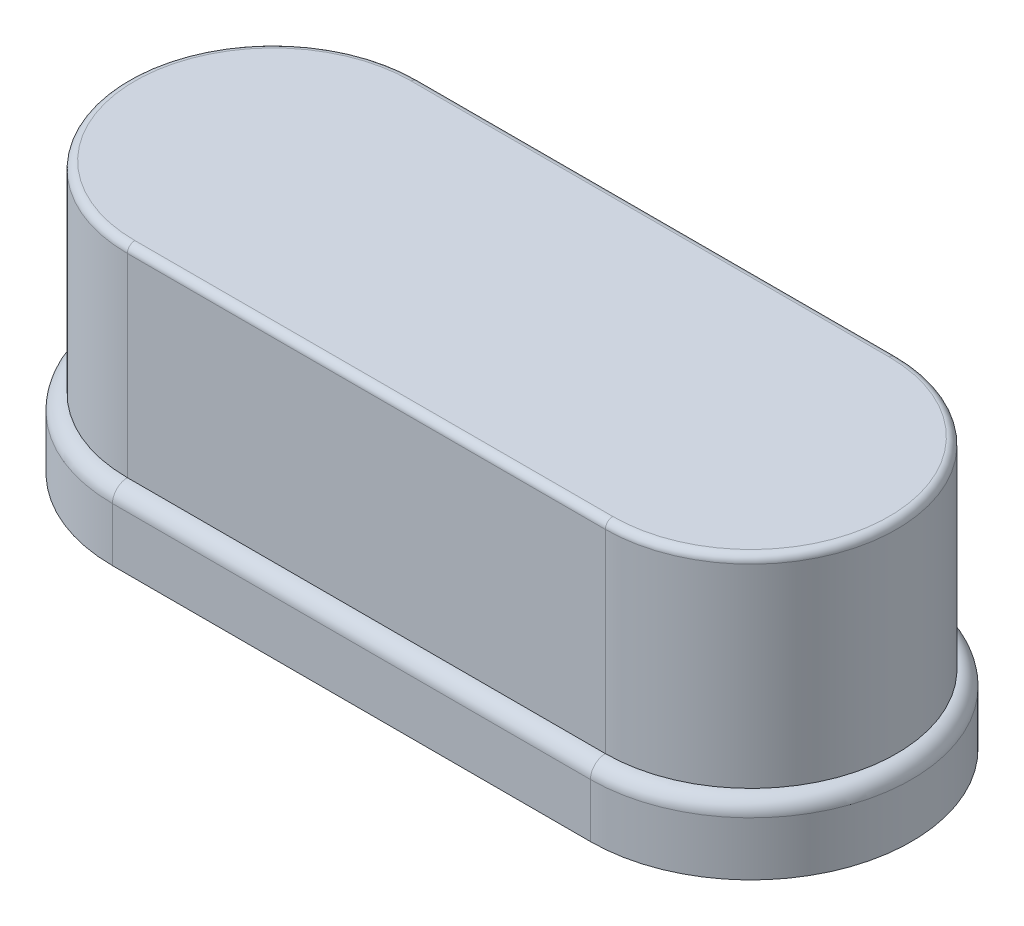
ISO-10303-21;
HEADER;
FILE_DESCRIPTION(('STEP AP214'),'2;1');
FILE_NAME('part.step','',(''),(''),'','','');
FILE_SCHEMA(('AUTOMOTIVE_DESIGN { 1 0 10303 214 1 1 1 1 }'));
ENDSEC;
DATA;
#1=APPLICATION_CONTEXT('core data for automotive mechanical design processes');
#2=APPLICATION_PROTOCOL_DEFINITION('international standard','automotive_design',2000,#1);
#3=PRODUCT_CONTEXT('',#1,'mechanical');
#4=PRODUCT('Part','Part','',(#3));
#5=PRODUCT_RELATED_PRODUCT_CATEGORY('part','',(#4));
#6=PRODUCT_DEFINITION_FORMATION('','',#4);
#7=PRODUCT_DEFINITION_CONTEXT('part definition',#1,'design');
#8=PRODUCT_DEFINITION('design','',#6,#7);
#9=PRODUCT_DEFINITION_SHAPE('','',#8);
#10=(LENGTH_UNIT() NAMED_UNIT(*) SI_UNIT(.MILLI.,.METRE.));
#11=(NAMED_UNIT(*) PLANE_ANGLE_UNIT() SI_UNIT($,.RADIAN.));
#12=(NAMED_UNIT(*) SI_UNIT($,.STERADIAN.) SOLID_ANGLE_UNIT());
#13=UNCERTAINTY_MEASURE_WITH_UNIT(LENGTH_MEASURE(1.E-05),#10,'distance_accuracy_value','');
#14=(GEOMETRIC_REPRESENTATION_CONTEXT(3) GLOBAL_UNCERTAINTY_ASSIGNED_CONTEXT((#13)) GLOBAL_UNIT_ASSIGNED_CONTEXT((#10,
#11,#12)) REPRESENTATION_CONTEXT('',''));
#15=CARTESIAN_POINT('',(0.,0.,0.));
#16=DIRECTION('',(0.,0.,1.));
#17=DIRECTION('',(1.,0.,0.));
#18=AXIS2_PLACEMENT_3D('',#15,#16,#17);
#19=CARTESIAN_POINT('',(8.77463258317007,0.92,-12.7227258149233));
#20=DIRECTION('',(0.,-1.,0.));
#21=DIRECTION('',(0.,0.,-1.));
#22=AXIS2_PLACEMENT_3D('',#19,#20,#21);
#23=CYLINDRICAL_SURFACE('',#22,2.15);
#24=DIRECTION('',(0.,-1.,0.));
#25=VECTOR('',#24,1.);
#26=CARTESIAN_POINT('',(8.77463258317007,0.92,-10.5727258149233));
#27=LINE('',#26,#25);
#28=CARTESIAN_POINT('',(8.77463258317007,0.72,-10.5727258149233));
#29=VERTEX_POINT('',#28);
#30=CARTESIAN_POINT('',(8.77463258317007,0.,-10.5727258149233));
#31=VERTEX_POINT('',#30);
#32=EDGE_CURVE('E132',#29,#31,#27,.T.);
#33=ORIENTED_EDGE('',*,*,#32,.F.);
#34=CARTESIAN_POINT('',(8.77463258317007,0.72,-12.7227258149233));
#35=DIRECTION('',(0.,1.,0.));
#36=DIRECTION('',(0.,0.,1.));
#37=AXIS2_PLACEMENT_3D('',#34,#35,#36);
#38=CIRCLE('',#37,2.15);
#39=CARTESIAN_POINT('',(8.77463258317007,0.72,-14.8727258149233));
#40=VERTEX_POINT('',#39);
#41=EDGE_CURVE('E157',#29,#40,#38,.F.);
#42=ORIENTED_EDGE('',*,*,#41,.T.);
#43=DIRECTION('',(0.,-1.,0.));
#44=VECTOR('',#43,1.);
#45=CARTESIAN_POINT('',(8.77463258317007,0.92,-14.8727258149233));
#46=LINE('',#45,#44);
#47=CARTESIAN_POINT('',(8.77463258317007,0.,-14.8727258149233));
#48=VERTEX_POINT('',#47);
#49=EDGE_CURVE('E217',#40,#48,#46,.T.);
#50=ORIENTED_EDGE('',*,*,#49,.T.);
#51=CARTESIAN_POINT('',(8.77463258317007,0.,-12.7227258149233));
#52=DIRECTION('',(0.,1.,0.));
#53=DIRECTION('',(0.,0.,1.));
#54=AXIS2_PLACEMENT_3D('',#51,#52,#53);
#55=CIRCLE('',#54,2.15);
#56=EDGE_CURVE('E165',#48,#31,#55,.T.);
#57=ORIENTED_EDGE('',*,*,#56,.T.);
#58=EDGE_LOOP('',(#33,#42,#50,#57));
#59=FACE_BOUND('',#58,.T.);
#60=ADVANCED_FACE('F33',(#59),#23,.T.);
#61=CARTESIAN_POINT('',(8.77463258317007,0.92,-10.5727258149233));
#62=DIRECTION('',(0.,0.,-1.));
#63=DIRECTION('',(-1.,0.,0.));
#64=AXIS2_PLACEMENT_3D('',#61,#62,#63);
#65=PLANE('',#64);
#66=DIRECTION('',(0.,-1.,0.));
#67=VECTOR('',#66,1.);
#68=CARTESIAN_POINT('',(15.1746325831701,0.92,-10.5727258149233));
#69=LINE('',#68,#67);
#70=CARTESIAN_POINT('',(15.1746325831701,0.72,-10.5727258149233));
#71=VERTEX_POINT('',#70);
#72=CARTESIAN_POINT('',(15.1746325831701,0.,-10.5727258149233));
#73=VERTEX_POINT('',#72);
#74=EDGE_CURVE('E221',#71,#73,#69,.T.);
#75=ORIENTED_EDGE('',*,*,#74,.F.);
#76=DIRECTION('',(1.,0.,0.));
#77=VECTOR('',#76,1.);
#78=CARTESIAN_POINT('',(8.77463258317007,0.72,-10.5727258149233));
#79=LINE('',#78,#77);
#80=EDGE_CURVE('E155',#71,#29,#79,.F.);
#81=ORIENTED_EDGE('',*,*,#80,.T.);
#82=ORIENTED_EDGE('',*,*,#32,.T.);
#83=DIRECTION('',(1.,0.,0.));
#84=VECTOR('',#83,1.);
#85=CARTESIAN_POINT('',(8.77463258317007,0.,-10.5727258149233));
#86=LINE('',#85,#84);
#87=EDGE_CURVE('E208',#31,#73,#86,.T.);
#88=ORIENTED_EDGE('',*,*,#87,.T.);
#89=EDGE_LOOP('',(#75,#81,#82,#88));
#90=FACE_BOUND('',#89,.T.);
#91=ADVANCED_FACE('F249',(#90),#65,.F.);
#92=CARTESIAN_POINT('',(15.1746325831701,0.92,-12.7227258149233));
#93=DIRECTION('',(0.,-1.,0.));
#94=DIRECTION('',(0.,0.,-1.));
#95=AXIS2_PLACEMENT_3D('',#92,#93,#94);
#96=CYLINDRICAL_SURFACE('',#95,2.15);
#97=DIRECTION('',(0.,-1.,0.));
#98=VECTOR('',#97,1.);
#99=CARTESIAN_POINT('',(15.1746325831701,0.92,-14.8727258149233));
#100=LINE('',#99,#98);
#101=CARTESIAN_POINT('',(15.1746325831701,0.72,-14.8727258149233));
#102=VERTEX_POINT('',#101);
#103=CARTESIAN_POINT('',(15.1746325831701,0.,-14.8727258149233));
#104=VERTEX_POINT('',#103);
#105=EDGE_CURVE('E219',#102,#104,#100,.T.);
#106=ORIENTED_EDGE('',*,*,#105,.F.);
#107=CARTESIAN_POINT('',(15.1746325831701,0.72,-12.7227258149233));
#108=DIRECTION('',(0.,1.,0.));
#109=DIRECTION('',(0.,0.,1.));
#110=AXIS2_PLACEMENT_3D('',#107,#108,#109);
#111=CIRCLE('',#110,2.15);
#112=EDGE_CURVE('E149',#102,#71,#111,.F.);
#113=ORIENTED_EDGE('',*,*,#112,.T.);
#114=ORIENTED_EDGE('',*,*,#74,.T.);
#115=CARTESIAN_POINT('',(15.1746325831701,0.,-12.7227258149233));
#116=DIRECTION('',(0.,1.,0.));
#117=DIRECTION('',(0.,0.,-1.));
#118=AXIS2_PLACEMENT_3D('',#115,#116,#117);
#119=CIRCLE('',#118,2.15);
#120=EDGE_CURVE('E211',#73,#104,#119,.T.);
#121=ORIENTED_EDGE('',*,*,#120,.T.);
#122=EDGE_LOOP('',(#106,#113,#114,#121));
#123=FACE_BOUND('',#122,.T.);
#124=ADVANCED_FACE('F239',(#123),#96,.T.);
#125=CARTESIAN_POINT('',(8.77463258317007,0.92,-14.8727258149233));
#126=DIRECTION('',(0.,0.,1.));
#127=DIRECTION('',(1.,0.,0.));
#128=AXIS2_PLACEMENT_3D('',#125,#126,#127);
#129=PLANE('',#128);
#130=ORIENTED_EDGE('',*,*,#49,.F.);
#131=DIRECTION('',(-1.,0.,0.));
#132=VECTOR('',#131,1.);
#133=CARTESIAN_POINT('',(15.1746325831701,0.72,-14.8727258149233));
#134=LINE('',#133,#132);
#135=EDGE_CURVE('E141',#40,#102,#134,.F.);
#136=ORIENTED_EDGE('',*,*,#135,.T.);
#137=ORIENTED_EDGE('',*,*,#105,.T.);
#138=DIRECTION('',(-1.,0.,0.));
#139=VECTOR('',#138,1.);
#140=CARTESIAN_POINT('',(8.77463258317007,0.,-14.8727258149233));
#141=LINE('',#140,#139);
#142=EDGE_CURVE('E214',#104,#48,#141,.T.);
#143=ORIENTED_EDGE('',*,*,#142,.T.);
#144=EDGE_LOOP('',(#130,#136,#137,#143));
#145=FACE_BOUND('',#144,.T.);
#146=ADVANCED_FACE('F238',(#145),#129,.F.);
#147=CARTESIAN_POINT('',(8.77463258317007,0.,-12.7227258149233));
#148=DIRECTION('',(0.,1.,0.));
#149=DIRECTION('',(0.,0.,1.));
#150=AXIS2_PLACEMENT_3D('',#147,#148,#149);
#151=PLANE('',#150);
#152=ORIENTED_EDGE('',*,*,#56,.F.);
#153=ORIENTED_EDGE('',*,*,#142,.F.);
#154=ORIENTED_EDGE('',*,*,#120,.F.);
#155=ORIENTED_EDGE('',*,*,#87,.F.);
#156=EDGE_LOOP('',(#152,#153,#154,#155));
#157=FACE_BOUND('',#156,.T.);
#158=ADVANCED_FACE('F245',(#157),#151,.F.);
#159=CARTESIAN_POINT('',(8.77463258317007,0.72,-10.7727258149233));
#160=DIRECTION('',(-1.,0.,0.));
#161=DIRECTION('',(0.,0.,1.));
#162=AXIS2_PLACEMENT_3D('',#159,#160,#161);
#163=CYLINDRICAL_SURFACE('',#162,0.2);
#164=CARTESIAN_POINT('',(8.77463258317007,0.72,-10.7727258149233));
#165=DIRECTION('',(-1.,0.,0.));
#166=DIRECTION('',(0.,0.,1.));
#167=AXIS2_PLACEMENT_3D('',#164,#165,#166);
#168=CIRCLE('',#167,0.2);
#169=CARTESIAN_POINT('',(8.77463258317007,0.92,-10.7727258149233));
#170=VERTEX_POINT('',#169);
#171=EDGE_CURVE('E130',#29,#170,#168,.T.);
#172=ORIENTED_EDGE('',*,*,#171,.F.);
#173=ORIENTED_EDGE('',*,*,#80,.F.);
#174=CARTESIAN_POINT('',(15.1746325831701,0.72,-10.7727258149233));
#175=DIRECTION('',(1.,0.,0.));
#176=DIRECTION('',(0.,0.,-1.));
#177=AXIS2_PLACEMENT_3D('',#174,#175,#176);
#178=CIRCLE('',#177,0.2);
#179=CARTESIAN_POINT('',(15.1746325831701,0.92,-10.7727258149233));
#180=VERTEX_POINT('',#179);
#181=EDGE_CURVE('E162',#180,#71,#178,.T.);
#182=ORIENTED_EDGE('',*,*,#181,.F.);
#183=DIRECTION('',(1.,0.,0.));
#184=VECTOR('',#183,1.);
#185=CARTESIAN_POINT('',(15.1746325831701,0.92,-10.7727258149233));
#186=LINE('',#185,#184);
#187=EDGE_CURVE('E131',#170,#180,#186,.T.);
#188=ORIENTED_EDGE('',*,*,#187,.F.);
#189=EDGE_LOOP('',(#172,#173,#182,#188));
#190=FACE_BOUND('',#189,.T.);
#191=ADVANCED_FACE('F228',(#190),#163,.T.);
#192=CARTESIAN_POINT('',(15.1746325831701,0.72,-12.7227258149233));
#193=DIRECTION('',(0.,1.,0.));
#194=DIRECTION('',(0.,0.,1.));
#195=AXIS2_PLACEMENT_3D('',#192,#193,#194);
#196=TOROIDAL_SURFACE('',#195,1.95,0.2);
#197=ORIENTED_EDGE('',*,*,#181,.T.);
#198=ORIENTED_EDGE('',*,*,#112,.F.);
#199=CARTESIAN_POINT('',(15.1746325831701,0.72,-14.6727258149233));
#200=DIRECTION('',(-1.,0.,0.));
#201=DIRECTION('',(0.,0.,1.));
#202=AXIS2_PLACEMENT_3D('',#199,#200,#201);
#203=CIRCLE('',#202,0.2);
#204=CARTESIAN_POINT('',(15.1746325831701,0.92,-14.6727258149233));
#205=VERTEX_POINT('',#204);
#206=EDGE_CURVE('E142',#205,#102,#203,.T.);
#207=ORIENTED_EDGE('',*,*,#206,.F.);
#208=CARTESIAN_POINT('',(15.1746325831701,0.92,-12.7227258149233));
#209=DIRECTION('',(0.,1.,0.));
#210=DIRECTION('',(0.,0.,1.));
#211=AXIS2_PLACEMENT_3D('',#208,#209,#210);
#212=CIRCLE('',#211,1.95);
#213=EDGE_CURVE('E147',#180,#205,#212,.T.);
#214=ORIENTED_EDGE('',*,*,#213,.F.);
#215=EDGE_LOOP('',(#197,#198,#207,#214));
#216=FACE_BOUND('',#215,.T.);
#217=ADVANCED_FACE('F232',(#216),#196,.T.);
#218=CARTESIAN_POINT('',(8.77463258317007,0.72,-12.7227258149233));
#219=DIRECTION('',(0.,1.,0.));
#220=DIRECTION('',(0.,0.,1.));
#221=AXIS2_PLACEMENT_3D('',#218,#219,#220);
#222=TOROIDAL_SURFACE('',#221,1.95,0.2);
#223=ORIENTED_EDGE('',*,*,#171,.T.);
#224=CARTESIAN_POINT('',(8.77463258317007,0.92,-12.7227258149233));
#225=DIRECTION('',(0.,1.,0.));
#226=DIRECTION('',(0.,0.,1.));
#227=AXIS2_PLACEMENT_3D('',#224,#225,#226);
#228=CIRCLE('',#227,1.95);
#229=CARTESIAN_POINT('',(8.77463258317007,0.92,-14.6727258149233));
#230=VERTEX_POINT('',#229);
#231=EDGE_CURVE('E114',#230,#170,#228,.T.);
#232=ORIENTED_EDGE('',*,*,#231,.F.);
#233=CARTESIAN_POINT('',(8.77463258317007,0.72,-14.6727258149233));
#234=DIRECTION('',(1.,0.,0.));
#235=DIRECTION('',(0.,0.,-1.));
#236=AXIS2_PLACEMENT_3D('',#233,#234,#235);
#237=CIRCLE('',#236,0.2);
#238=EDGE_CURVE('E128',#40,#230,#237,.T.);
#239=ORIENTED_EDGE('',*,*,#238,.F.);
#240=ORIENTED_EDGE('',*,*,#41,.F.);
#241=EDGE_LOOP('',(#223,#232,#239,#240));
#242=FACE_BOUND('',#241,.T.);
#243=ADVANCED_FACE('F126',(#242),#222,.T.);
#244=CARTESIAN_POINT('',(8.77463258317007,0.72,-14.6727258149233));
#245=DIRECTION('',(1.,0.,0.));
#246=DIRECTION('',(0.,0.,-1.));
#247=AXIS2_PLACEMENT_3D('',#244,#245,#246);
#248=CYLINDRICAL_SURFACE('',#247,0.2);
#249=ORIENTED_EDGE('',*,*,#206,.T.);
#250=ORIENTED_EDGE('',*,*,#135,.F.);
#251=ORIENTED_EDGE('',*,*,#238,.T.);
#252=DIRECTION('',(-1.,0.,0.));
#253=VECTOR('',#252,1.);
#254=CARTESIAN_POINT('',(8.77463258317007,0.92,-14.6727258149233));
#255=LINE('',#254,#253);
#256=EDGE_CURVE('E138',#205,#230,#255,.T.);
#257=ORIENTED_EDGE('',*,*,#256,.F.);
#258=EDGE_LOOP('',(#249,#250,#251,#257));
#259=FACE_BOUND('',#258,.T.);
#260=ADVANCED_FACE('F137',(#259),#248,.T.);
#261=CARTESIAN_POINT('',(8.77463258317007,3.62,-12.7227258149233));
#262=DIRECTION('',(0.,-1.,0.));
#263=DIRECTION('',(0.,0.,-1.));
#264=AXIS2_PLACEMENT_3D('',#261,#262,#263);
#265=CYLINDRICAL_SURFACE('',#264,1.95);
#266=DIRECTION('',(0.,-1.,0.));
#267=VECTOR('',#266,1.);
#268=CARTESIAN_POINT('',(8.77463258317007,3.62,-10.7727258149233));
#269=LINE('',#268,#267);
#270=CARTESIAN_POINT('',(8.77463258317007,3.52,-10.7727258149233));
#271=VERTEX_POINT('',#270);
#272=EDGE_CURVE('E143',#271,#170,#269,.T.);
#273=ORIENTED_EDGE('',*,*,#272,.F.);
#274=CARTESIAN_POINT('',(8.77463258317007,3.52,-12.7227258149233));
#275=DIRECTION('',(0.,-1.,0.));
#276=DIRECTION('',(0.,0.,-1.));
#277=AXIS2_PLACEMENT_3D('',#274,#275,#276);
#278=CIRCLE('',#277,1.95);
#279=CARTESIAN_POINT('',(8.77463258317007,3.52,-14.6727258149233));
#280=VERTEX_POINT('',#279);
#281=EDGE_CURVE('E11',#271,#280,#278,.T.);
#282=ORIENTED_EDGE('',*,*,#281,.T.);
#283=DIRECTION('',(0.,-1.,0.));
#284=VECTOR('',#283,1.);
#285=CARTESIAN_POINT('',(8.77463258317007,3.62,-14.6727258149233));
#286=LINE('',#285,#284);
#287=EDGE_CURVE('E111',#280,#230,#286,.T.);
#288=ORIENTED_EDGE('',*,*,#287,.T.);
#289=ORIENTED_EDGE('',*,*,#231,.T.);
#290=EDGE_LOOP('',(#273,#282,#288,#289));
#291=FACE_BOUND('',#290,.T.);
#292=ADVANCED_FACE('F113',(#291),#265,.T.);
#293=CARTESIAN_POINT('',(8.77463258317007,3.62,-10.7727258149233));
#294=DIRECTION('',(0.,0.,-1.));
#295=DIRECTION('',(-1.,0.,0.));
#296=AXIS2_PLACEMENT_3D('',#293,#294,#295);
#297=PLANE('',#296);
#298=DIRECTION('',(0.,-1.,0.));
#299=VECTOR('',#298,1.);
#300=CARTESIAN_POINT('',(15.1746325831701,3.62,-10.7727258149233));
#301=LINE('',#300,#299);
#302=CARTESIAN_POINT('',(15.1746325831701,3.52,-10.7727258149233));
#303=VERTEX_POINT('',#302);
#304=EDGE_CURVE('E201',#303,#180,#301,.T.);
#305=ORIENTED_EDGE('',*,*,#304,.F.);
#306=DIRECTION('',(1.,0.,0.));
#307=VECTOR('',#306,1.);
#308=CARTESIAN_POINT('',(8.77463258317007,3.52,-10.7727258149233));
#309=LINE('',#308,#307);
#310=EDGE_CURVE('E42',#303,#271,#309,.F.);
#311=ORIENTED_EDGE('',*,*,#310,.T.);
#312=ORIENTED_EDGE('',*,*,#272,.T.);
#313=ORIENTED_EDGE('',*,*,#187,.T.);
#314=EDGE_LOOP('',(#305,#311,#312,#313));
#315=FACE_BOUND('',#314,.T.);
#316=ADVANCED_FACE('F225',(#315),#297,.F.);
#317=CARTESIAN_POINT('',(15.1746325831701,3.62,-12.7227258149233));
#318=DIRECTION('',(0.,-1.,0.));
#319=DIRECTION('',(0.,0.,-1.));
#320=AXIS2_PLACEMENT_3D('',#317,#318,#319);
#321=CYLINDRICAL_SURFACE('',#320,1.95);
#322=DIRECTION('',(0.,-1.,0.));
#323=VECTOR('',#322,1.);
#324=CARTESIAN_POINT('',(15.1746325831701,3.62,-14.6727258149233));
#325=LINE('',#324,#323);
#326=CARTESIAN_POINT('',(15.1746325831701,3.52,-14.6727258149233));
#327=VERTEX_POINT('',#326);
#328=EDGE_CURVE('E120',#327,#205,#325,.T.);
#329=ORIENTED_EDGE('',*,*,#328,.F.);
#330=CARTESIAN_POINT('',(15.1746325831701,3.52,-12.7227258149233));
#331=DIRECTION('',(0.,-1.,0.));
#332=DIRECTION('',(0.,0.,-1.));
#333=AXIS2_PLACEMENT_3D('',#330,#331,#332);
#334=CIRCLE('',#333,1.95);
#335=EDGE_CURVE('E57',#327,#303,#334,.T.);
#336=ORIENTED_EDGE('',*,*,#335,.T.);
#337=ORIENTED_EDGE('',*,*,#304,.T.);
#338=ORIENTED_EDGE('',*,*,#213,.T.);
#339=EDGE_LOOP('',(#329,#336,#337,#338));
#340=FACE_BOUND('',#339,.T.);
#341=ADVANCED_FACE('F199',(#340),#321,.T.);
#342=CARTESIAN_POINT('',(8.77463258317007,3.62,-14.6727258149233));
#343=DIRECTION('',(0.,0.,1.));
#344=DIRECTION('',(1.,0.,0.));
#345=AXIS2_PLACEMENT_3D('',#342,#343,#344);
#346=PLANE('',#345);
#347=ORIENTED_EDGE('',*,*,#287,.F.);
#348=DIRECTION('',(-1.,0.,0.));
#349=VECTOR('',#348,1.);
#350=CARTESIAN_POINT('',(8.77463258317007,3.52,-14.6727258149233));
#351=LINE('',#350,#349);
#352=EDGE_CURVE('E174',#280,#327,#351,.F.);
#353=ORIENTED_EDGE('',*,*,#352,.T.);
#354=ORIENTED_EDGE('',*,*,#328,.T.);
#355=ORIENTED_EDGE('',*,*,#256,.T.);
#356=EDGE_LOOP('',(#347,#353,#354,#355));
#357=FACE_BOUND('',#356,.T.);
#358=ADVANCED_FACE('F145',(#357),#346,.F.);
#359=CARTESIAN_POINT('',(8.77463258317007,3.62,-12.7227258149233));
#360=DIRECTION('',(0.,-1.,0.));
#361=DIRECTION('',(0.,0.,-1.));
#362=AXIS2_PLACEMENT_3D('',#359,#360,#361);
#363=PLANE('',#362);
#364=CARTESIAN_POINT('',(15.1746325831701,3.62,-12.7227258149233));
#365=DIRECTION('',(0.,-1.,0.));
#366=DIRECTION('',(0.,0.,-1.));
#367=AXIS2_PLACEMENT_3D('',#364,#365,#366);
#368=CIRCLE('',#367,1.85);
#369=CARTESIAN_POINT('',(15.1746325831701,3.62,-10.8727258149233));
#370=VERTEX_POINT('',#369);
#371=CARTESIAN_POINT('',(15.1746325831701,3.62,-14.5727258149233));
#372=VERTEX_POINT('',#371);
#373=EDGE_CURVE('E169',#370,#372,#368,.F.);
#374=ORIENTED_EDGE('',*,*,#373,.T.);
#375=DIRECTION('',(-1.,0.,0.));
#376=VECTOR('',#375,1.);
#377=CARTESIAN_POINT('',(8.77463258317007,3.62,-14.5727258149233));
#378=LINE('',#377,#376);
#379=CARTESIAN_POINT('',(8.77463258317007,3.62,-14.5727258149233));
#380=VERTEX_POINT('',#379);
#381=EDGE_CURVE('E171',#372,#380,#378,.T.);
#382=ORIENTED_EDGE('',*,*,#381,.T.);
#383=CARTESIAN_POINT('',(8.77463258317007,3.62,-12.7227258149233));
#384=DIRECTION('',(0.,-1.,0.));
#385=DIRECTION('',(0.,0.,-1.));
#386=AXIS2_PLACEMENT_3D('',#383,#384,#385);
#387=CIRCLE('',#386,1.85);
#388=CARTESIAN_POINT('',(8.77463258317007,3.62,-10.8727258149233));
#389=VERTEX_POINT('',#388);
#390=EDGE_CURVE('E158',#380,#389,#387,.F.);
#391=ORIENTED_EDGE('',*,*,#390,.T.);
#392=DIRECTION('',(1.,0.,0.));
#393=VECTOR('',#392,1.);
#394=CARTESIAN_POINT('',(8.77463258317007,3.62,-10.8727258149233));
#395=LINE('',#394,#393);
#396=EDGE_CURVE('E167',#389,#370,#395,.T.);
#397=ORIENTED_EDGE('',*,*,#396,.T.);
#398=EDGE_LOOP('',(#374,#382,#391,#397));
#399=FACE_BOUND('',#398,.T.);
#400=ADVANCED_FACE('F275',(#399),#363,.F.);
#401=CARTESIAN_POINT('',(8.77463258317007,3.52,-10.8727258149233));
#402=DIRECTION('',(1.,0.,0.));
#403=DIRECTION('',(0.,0.,-1.));
#404=AXIS2_PLACEMENT_3D('',#401,#402,#403);
#405=CYLINDRICAL_SURFACE('',#404,0.1);
#406=CARTESIAN_POINT('',(8.77463258317007,3.52,-10.8727258149233));
#407=DIRECTION('',(-1.,0.,0.));
#408=DIRECTION('',(0.,0.,1.));
#409=AXIS2_PLACEMENT_3D('',#406,#407,#408);
#410=CIRCLE('',#409,0.1);
#411=EDGE_CURVE('E181',#271,#389,#410,.T.);
#412=ORIENTED_EDGE('',*,*,#411,.F.);
#413=ORIENTED_EDGE('',*,*,#310,.F.);
#414=CARTESIAN_POINT('',(15.1746325831701,3.52,-10.8727258149233));
#415=DIRECTION('',(1.,0.,0.));
#416=DIRECTION('',(0.,0.,-1.));
#417=AXIS2_PLACEMENT_3D('',#414,#415,#416);
#418=CIRCLE('',#417,0.1);
#419=EDGE_CURVE('E37',#370,#303,#418,.T.);
#420=ORIENTED_EDGE('',*,*,#419,.F.);
#421=ORIENTED_EDGE('',*,*,#396,.F.);
#422=EDGE_LOOP('',(#412,#413,#420,#421));
#423=FACE_BOUND('',#422,.T.);
#424=ADVANCED_FACE('F35',(#423),#405,.T.);
#425=CARTESIAN_POINT('',(15.1746325831701,3.52,-12.7227258149233));
#426=DIRECTION('',(0.,-1.,0.));
#427=DIRECTION('',(0.,0.,-1.));
#428=AXIS2_PLACEMENT_3D('',#425,#426,#427);
#429=TOROIDAL_SURFACE('',#428,1.85,0.1);
#430=ORIENTED_EDGE('',*,*,#419,.T.);
#431=ORIENTED_EDGE('',*,*,#335,.F.);
#432=CARTESIAN_POINT('',(15.1746325831701,3.52,-14.5727258149233));
#433=DIRECTION('',(-1.,0.,0.));
#434=DIRECTION('',(0.,0.,1.));
#435=AXIS2_PLACEMENT_3D('',#432,#433,#434);
#436=CIRCLE('',#435,0.1);
#437=EDGE_CURVE('E180',#372,#327,#436,.T.);
#438=ORIENTED_EDGE('',*,*,#437,.F.);
#439=ORIENTED_EDGE('',*,*,#373,.F.);
#440=EDGE_LOOP('',(#430,#431,#438,#439));
#441=FACE_BOUND('',#440,.T.);
#442=ADVANCED_FACE('F190',(#441),#429,.T.);
#443=CARTESIAN_POINT('',(8.77463258317007,3.52,-12.7227258149233));
#444=DIRECTION('',(0.,-1.,0.));
#445=DIRECTION('',(0.,0.,-1.));
#446=AXIS2_PLACEMENT_3D('',#443,#444,#445);
#447=TOROIDAL_SURFACE('',#446,1.85,0.1);
#448=ORIENTED_EDGE('',*,*,#411,.T.);
#449=ORIENTED_EDGE('',*,*,#390,.F.);
#450=CARTESIAN_POINT('',(8.77463258317007,3.52,-14.5727258149233));
#451=DIRECTION('',(1.,0.,0.));
#452=DIRECTION('',(0.,0.,-1.));
#453=AXIS2_PLACEMENT_3D('',#450,#451,#452);
#454=CIRCLE('',#453,0.1);
#455=EDGE_CURVE('E178',#280,#380,#454,.T.);
#456=ORIENTED_EDGE('',*,*,#455,.F.);
#457=ORIENTED_EDGE('',*,*,#281,.F.);
#458=EDGE_LOOP('',(#448,#449,#456,#457));
#459=FACE_BOUND('',#458,.T.);
#460=ADVANCED_FACE('F195',(#459),#447,.T.);
#461=CARTESIAN_POINT('',(8.77463258317007,3.52,-14.5727258149233));
#462=DIRECTION('',(-1.,0.,0.));
#463=DIRECTION('',(0.,0.,1.));
#464=AXIS2_PLACEMENT_3D('',#461,#462,#463);
#465=CYLINDRICAL_SURFACE('',#464,0.1);
#466=ORIENTED_EDGE('',*,*,#437,.T.);
#467=ORIENTED_EDGE('',*,*,#352,.F.);
#468=ORIENTED_EDGE('',*,*,#455,.T.);
#469=ORIENTED_EDGE('',*,*,#381,.F.);
#470=EDGE_LOOP('',(#466,#467,#468,#469));
#471=FACE_BOUND('',#470,.T.);
#472=ADVANCED_FACE('F198',(#471),#465,.T.);
#473=CLOSED_SHELL('',(#60,#91,#124,#146,#158,#191,#217,#243,#260,#292,#316,#341,#358,#400,#424,
#442,#460,#472));
#474=MANIFOLD_SOLID_BREP('B2',#473);
#475=ADVANCED_BREP_SHAPE_REPRESENTATION('',(#18,#474),#14);
#476=SHAPE_DEFINITION_REPRESENTATION(#9,#475);
ENDSEC;
END-ISO-10303-21;
